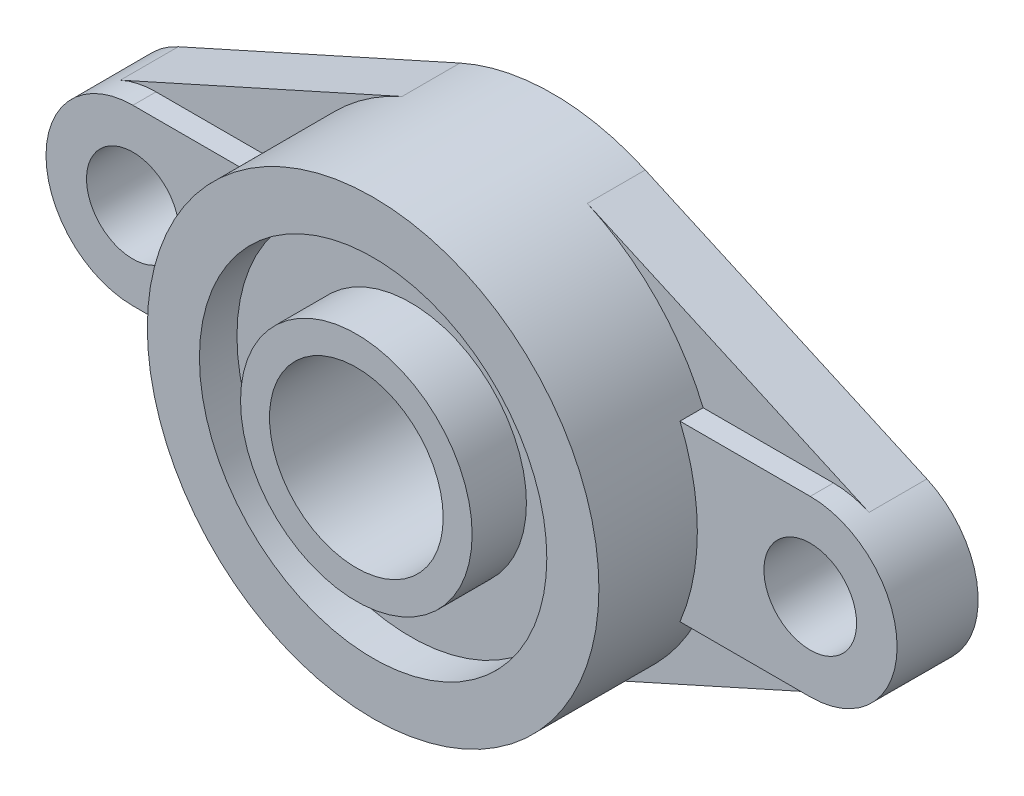
ISO-10303-21;
HEADER;
FILE_DESCRIPTION(('STEP AP214'),'2;1');
FILE_NAME('part.step','',(''),(''),'','','');
FILE_SCHEMA(('AUTOMOTIVE_DESIGN { 1 0 10303 214 1 1 1 1 }'));
ENDSEC;
DATA;
#1=APPLICATION_CONTEXT('core data for automotive mechanical design processes');
#2=APPLICATION_PROTOCOL_DEFINITION('international standard','automotive_design',2000,#1);
#3=PRODUCT_CONTEXT('',#1,'mechanical');
#4=PRODUCT('Part','Part','',(#3));
#5=PRODUCT_RELATED_PRODUCT_CATEGORY('part','',(#4));
#6=PRODUCT_DEFINITION_FORMATION('','',#4);
#7=PRODUCT_DEFINITION_CONTEXT('part definition',#1,'design');
#8=PRODUCT_DEFINITION('design','',#6,#7);
#9=PRODUCT_DEFINITION_SHAPE('','',#8);
#10=(LENGTH_UNIT() NAMED_UNIT(*) SI_UNIT(.MILLI.,.METRE.));
#11=(NAMED_UNIT(*) PLANE_ANGLE_UNIT() SI_UNIT($,.RADIAN.));
#12=(NAMED_UNIT(*) SI_UNIT($,.STERADIAN.) SOLID_ANGLE_UNIT());
#13=UNCERTAINTY_MEASURE_WITH_UNIT(LENGTH_MEASURE(1.E-05),#10,'distance_accuracy_value','');
#14=(GEOMETRIC_REPRESENTATION_CONTEXT(3) GLOBAL_UNCERTAINTY_ASSIGNED_CONTEXT((#13)) GLOBAL_UNIT_ASSIGNED_CONTEXT((#10,
#11,#12)) REPRESENTATION_CONTEXT('',''));
#15=CARTESIAN_POINT('',(0.,0.,0.));
#16=DIRECTION('',(0.,0.,1.));
#17=DIRECTION('',(1.,0.,0.));
#18=AXIS2_PLACEMENT_3D('',#15,#16,#17);
#19=CARTESIAN_POINT('',(0.,15.,33.9));
#20=DIRECTION('',(0.,0.,1.));
#21=DIRECTION('',(1.,0.,0.));
#22=AXIS2_PLACEMENT_3D('',#19,#20,#21);
#23=PLANE('',#22);
#24=CARTESIAN_POINT('',(0.,0.,33.9));
#25=DIRECTION('',(0.,0.,-1.));
#26=DIRECTION('',(-1.,0.,0.));
#27=AXIS2_PLACEMENT_3D('',#24,#25,#26);
#28=CIRCLE('',#27,20.);
#29=CARTESIAN_POINT('',(-20.,0.,33.9));
#30=VERTEX_POINT('',#29);
#31=EDGE_CURVE('E178',#30,#30,#28,.T.);
#32=ORIENTED_EDGE('',*,*,#31,.F.);
#33=EDGE_LOOP('',(#32));
#34=FACE_BOUND('',#33,.T.);
#35=CARTESIAN_POINT('',(0.,0.,33.9));
#36=DIRECTION('',(0.,0.,-1.));
#37=DIRECTION('',(1.,0.,0.));
#38=AXIS2_PLACEMENT_3D('',#35,#36,#37);
#39=CIRCLE('',#38,15.);
#40=CARTESIAN_POINT('',(15.,0.,33.9));
#41=VERTEX_POINT('',#40);
#42=EDGE_CURVE('E382',#41,#41,#39,.T.);
#43=ORIENTED_EDGE('',*,*,#42,.T.);
#44=EDGE_LOOP('',(#43));
#45=FACE_BOUND('',#44,.T.);
#46=ADVANCED_FACE('F16',(#34,#45),#23,.T.);
#47=CARTESIAN_POINT('',(0.,15.,-4.1));
#48=DIRECTION('',(0.,0.,1.));
#49=DIRECTION('',(1.,0.,0.));
#50=AXIS2_PLACEMENT_3D('',#47,#48,#49);
#51=PLANE('',#50);
#52=CARTESIAN_POINT('',(0.,0.,-4.1));
#53=DIRECTION('',(0.,0.,-1.));
#54=DIRECTION('',(-1.,0.,0.));
#55=AXIS2_PLACEMENT_3D('',#52,#53,#54);
#56=CIRCLE('',#55,20.);
#57=CARTESIAN_POINT('',(-20.,0.,-4.1));
#58=VERTEX_POINT('',#57);
#59=EDGE_CURVE('E162',#58,#58,#56,.T.);
#60=ORIENTED_EDGE('',*,*,#59,.T.);
#61=EDGE_LOOP('',(#60));
#62=FACE_BOUND('',#61,.T.);
#63=CARTESIAN_POINT('',(0.,0.,-4.1));
#64=DIRECTION('',(0.,0.,1.));
#65=DIRECTION('',(1.,0.,0.));
#66=AXIS2_PLACEMENT_3D('',#63,#64,#65);
#67=CIRCLE('',#66,15.);
#68=CARTESIAN_POINT('',(15.,0.,-4.09999999999999));
#69=VERTEX_POINT('',#68);
#70=EDGE_CURVE('E385',#69,#69,#67,.F.);
#71=ORIENTED_EDGE('',*,*,#70,.F.);
#72=EDGE_LOOP('',(#71));
#73=FACE_BOUND('',#72,.T.);
#74=ADVANCED_FACE('F395',(#62,#73),#51,.F.);
#75=CARTESIAN_POINT('',(-58.5,0.,9.99999999999997));
#76=DIRECTION('',(0.,0.,-1.));
#77=DIRECTION('',(-1.,0.,0.));
#78=AXIS2_PLACEMENT_3D('',#75,#76,#77);
#79=PLANE('',#78);
#80=CARTESIAN_POINT('',(0.,0.,10.));
#81=DIRECTION('',(0.,0.,-1.));
#82=DIRECTION('',(-1.,0.,0.));
#83=AXIS2_PLACEMENT_3D('',#80,#81,#82);
#84=CIRCLE('',#83,39.);
#85=CARTESIAN_POINT('',(-16.,-35.5668384875575,10.));
#86=VERTEX_POINT('',#85);
#87=CARTESIAN_POINT('',(-36.,-15.,9.99999999999998));
#88=VERTEX_POINT('',#87);
#89=EDGE_CURVE('E135',#86,#88,#84,.T.);
#90=ORIENTED_EDGE('',*,*,#89,.T.);
#91=DIRECTION('',(-1.,0.,0.));
#92=VECTOR('',#91,1.);
#93=CARTESIAN_POINT('',(-58.5,-15.0000000000001,9.99999999999997));
#94=LINE('',#93,#92);
#95=CARTESIAN_POINT('',(-58.5,-15.0000000000001,9.99999999999997));
#96=VERTEX_POINT('',#95);
#97=EDGE_CURVE('E192',#88,#96,#94,.T.);
#98=ORIENTED_EDGE('',*,*,#97,.T.);
#99=CARTESIAN_POINT('',(-58.5,0.,9.99999999999997));
#100=DIRECTION('',(0.,0.,-1.));
#101=DIRECTION('',(1.,0.,0.));
#102=AXIS2_PLACEMENT_3D('',#99,#100,#101);
#103=CIRCLE('',#102,15.);
#104=CARTESIAN_POINT('',(-64.6538461538462,-13.6795532644452,9.99999999999998));
#105=VERTEX_POINT('',#104);
#106=EDGE_CURVE('E138',#96,#105,#103,.T.);
#107=ORIENTED_EDGE('',*,*,#106,.T.);
#108=DIRECTION('',(-0.911970217629679,0.41025641025641,0.));
#109=VECTOR('',#108,1.);
#110=CARTESIAN_POINT('',(-64.6538461538462,-13.6795532644453,9.99999999999998));
#111=LINE('',#110,#109);
#112=EDGE_CURVE('E131',#86,#105,#111,.T.);
#113=ORIENTED_EDGE('',*,*,#112,.F.);
#114=EDGE_LOOP('',(#90,#98,#107,#113));
#115=FACE_BOUND('',#114,.T.);
#116=ADVANCED_FACE('F133',(#115),#79,.F.);
#117=CARTESIAN_POINT('',(36.,-15.,10.));
#118=VERTEX_POINT('',#117);
#119=CARTESIAN_POINT('',(16.,-35.5668384875575,10.));
#120=VERTEX_POINT('',#119);
#121=EDGE_CURVE('E159',#118,#120,#84,.T.);
#122=ORIENTED_EDGE('',*,*,#121,.T.);
#123=DIRECTION('',(-0.911970217629678,-0.410256410256412,0.));
#124=VECTOR('',#123,1.);
#125=CARTESIAN_POINT('',(64.6538461538462,-13.6795532644452,10.));
#126=LINE('',#125,#124);
#127=CARTESIAN_POINT('',(64.6538461538462,-13.6795532644452,10.));
#128=VERTEX_POINT('',#127);
#129=EDGE_CURVE('E142',#128,#120,#126,.T.);
#130=ORIENTED_EDGE('',*,*,#129,.F.);
#131=CARTESIAN_POINT('',(58.5,0.,10.));
#132=DIRECTION('',(0.,0.,-1.));
#133=DIRECTION('',(-1.,0.,0.));
#134=AXIS2_PLACEMENT_3D('',#131,#132,#133);
#135=CIRCLE('',#134,15.);
#136=CARTESIAN_POINT('',(58.5,-15.,10.));
#137=VERTEX_POINT('',#136);
#138=EDGE_CURVE('E241',#128,#137,#135,.T.);
#139=ORIENTED_EDGE('',*,*,#138,.T.);
#140=EDGE_CURVE('E188',#137,#118,#94,.T.);
#141=ORIENTED_EDGE('',*,*,#140,.T.);
#142=EDGE_LOOP('',(#122,#130,#139,#141));
#143=FACE_BOUND('',#142,.T.);
#144=ADVANCED_FACE('F357',(#143),#79,.F.);
#145=CARTESIAN_POINT('',(16.,35.5668384875575,10.));
#146=VERTEX_POINT('',#145);
#147=CARTESIAN_POINT('',(36.,15.,10.));
#148=VERTEX_POINT('',#147);
#149=EDGE_CURVE('E32',#146,#148,#84,.T.);
#150=ORIENTED_EDGE('',*,*,#149,.T.);
#151=DIRECTION('',(1.,0.,0.));
#152=VECTOR('',#151,1.);
#153=CARTESIAN_POINT('',(-58.5,15.,9.99999999999997));
#154=LINE('',#153,#152);
#155=CARTESIAN_POINT('',(58.5,15.,10.));
#156=VERTEX_POINT('',#155);
#157=EDGE_CURVE('E187',#148,#156,#154,.T.);
#158=ORIENTED_EDGE('',*,*,#157,.T.);
#159=CARTESIAN_POINT('',(64.6538461538463,13.6795532644452,10.));
#160=VERTEX_POINT('',#159);
#161=EDGE_CURVE('E196',#156,#160,#135,.T.);
#162=ORIENTED_EDGE('',*,*,#161,.T.);
#163=DIRECTION('',(0.911970217629679,-0.41025641025641,0.));
#164=VECTOR('',#163,1.);
#165=CARTESIAN_POINT('',(16.,35.5668384875575,10.));
#166=LINE('',#165,#164);
#167=EDGE_CURVE('E255',#146,#160,#166,.T.);
#168=ORIENTED_EDGE('',*,*,#167,.F.);
#169=EDGE_LOOP('',(#150,#158,#162,#168));
#170=FACE_BOUND('',#169,.T.);
#171=ADVANCED_FACE('F417',(#170),#79,.F.);
#172=CARTESIAN_POINT('',(-36.,15.,9.99999999999998));
#173=VERTEX_POINT('',#172);
#174=CARTESIAN_POINT('',(-16.,35.5668384875575,9.99999999999998));
#175=VERTEX_POINT('',#174);
#176=EDGE_CURVE('E160',#173,#175,#84,.T.);
#177=ORIENTED_EDGE('',*,*,#176,.T.);
#178=DIRECTION('',(0.911970217629679,0.410256410256411,0.));
#179=VECTOR('',#178,1.);
#180=CARTESIAN_POINT('',(-64.6538461538461,13.6795532644452,9.99999999999997));
#181=LINE('',#180,#179);
#182=CARTESIAN_POINT('',(-64.6538461538461,13.6795532644452,9.99999999999997));
#183=VERTEX_POINT('',#182);
#184=EDGE_CURVE('E264',#183,#175,#181,.T.);
#185=ORIENTED_EDGE('',*,*,#184,.F.);
#186=CARTESIAN_POINT('',(-58.5,15.,9.99999999999997));
#187=VERTEX_POINT('',#186);
#188=EDGE_CURVE('E246',#183,#187,#103,.T.);
#189=ORIENTED_EDGE('',*,*,#188,.T.);
#190=EDGE_CURVE('E193',#187,#173,#154,.T.);
#191=ORIENTED_EDGE('',*,*,#190,.T.);
#192=EDGE_LOOP('',(#177,#185,#189,#191));
#193=FACE_BOUND('',#192,.T.);
#194=ADVANCED_FACE('F318',(#193),#79,.F.);
#195=CARTESIAN_POINT('',(-58.5,0.,0.));
#196=DIRECTION('',(0.,0.,-1.));
#197=DIRECTION('',(-1.,0.,0.));
#198=AXIS2_PLACEMENT_3D('',#195,#196,#197);
#199=PLANE('',#198);
#200=CARTESIAN_POINT('',(58.5,0.,0.));
#201=DIRECTION('',(0.,0.,1.));
#202=DIRECTION('',(1.,0.,0.));
#203=AXIS2_PLACEMENT_3D('',#200,#201,#202);
#204=CIRCLE('',#203,8.);
#205=CARTESIAN_POINT('',(66.5,0.,0.));
#206=VERTEX_POINT('',#205);
#207=EDGE_CURVE('E268',#206,#206,#204,.T.);
#208=ORIENTED_EDGE('',*,*,#207,.T.);
#209=EDGE_LOOP('',(#208));
#210=FACE_BOUND('',#209,.T.);
#211=CARTESIAN_POINT('',(-58.5,0.,0.));
#212=DIRECTION('',(0.,0.,-1.));
#213=DIRECTION('',(1.,0.,0.));
#214=AXIS2_PLACEMENT_3D('',#211,#212,#213);
#215=CIRCLE('',#214,15.);
#216=CARTESIAN_POINT('',(-64.6538461538462,-13.6795532644452,0.));
#217=VERTEX_POINT('',#216);
#218=CARTESIAN_POINT('',(-64.6538461538461,13.6795532644452,0.));
#219=VERTEX_POINT('',#218);
#220=EDGE_CURVE('E227',#217,#219,#215,.T.);
#221=ORIENTED_EDGE('',*,*,#220,.T.);
#222=DIRECTION('',(0.911970217629679,0.410256410256411,0.));
#223=VECTOR('',#222,1.);
#224=CARTESIAN_POINT('',(-64.6538461538461,13.6795532644452,0.));
#225=LINE('',#224,#223);
#226=CARTESIAN_POINT('',(-16.,35.5668384875575,0.));
#227=VERTEX_POINT('',#226);
#228=EDGE_CURVE('E299',#219,#227,#225,.T.);
#229=ORIENTED_EDGE('',*,*,#228,.T.);
#230=CARTESIAN_POINT('',(0.,0.,0.));
#231=DIRECTION('',(0.,0.,-1.));
#232=DIRECTION('',(1.,0.,0.));
#233=AXIS2_PLACEMENT_3D('',#230,#231,#232);
#234=CIRCLE('',#233,39.);
#235=CARTESIAN_POINT('',(16.,35.5668384875574,0.));
#236=VERTEX_POINT('',#235);
#237=EDGE_CURVE('E304',#227,#236,#234,.T.);
#238=ORIENTED_EDGE('',*,*,#237,.T.);
#239=DIRECTION('',(0.911970217629679,-0.41025641025641,0.));
#240=VECTOR('',#239,1.);
#241=CARTESIAN_POINT('',(16.,35.5668384875574,0.));
#242=LINE('',#241,#240);
#243=CARTESIAN_POINT('',(64.6538461538463,13.6795532644452,0.));
#244=VERTEX_POINT('',#243);
#245=EDGE_CURVE('E324',#236,#244,#242,.T.);
#246=ORIENTED_EDGE('',*,*,#245,.T.);
#247=CARTESIAN_POINT('',(58.5,0.,0.));
#248=DIRECTION('',(0.,0.,-1.));
#249=DIRECTION('',(-1.,0.,0.));
#250=AXIS2_PLACEMENT_3D('',#247,#248,#249);
#251=CIRCLE('',#250,15.);
#252=CARTESIAN_POINT('',(64.6538461538462,-13.6795532644452,0.));
#253=VERTEX_POINT('',#252);
#254=EDGE_CURVE('E329',#244,#253,#251,.T.);
#255=ORIENTED_EDGE('',*,*,#254,.T.);
#256=DIRECTION('',(-0.911970217629678,-0.410256410256412,0.));
#257=VECTOR('',#256,1.);
#258=CARTESIAN_POINT('',(64.6538461538462,-13.6795532644452,0.));
#259=LINE('',#258,#257);
#260=CARTESIAN_POINT('',(16.,-35.5668384875575,0.));
#261=VERTEX_POINT('',#260);
#262=EDGE_CURVE('E334',#253,#261,#259,.T.);
#263=ORIENTED_EDGE('',*,*,#262,.T.);
#264=CARTESIAN_POINT('',(0.,0.,0.));
#265=DIRECTION('',(0.,0.,-1.));
#266=DIRECTION('',(1.,0.,0.));
#267=AXIS2_PLACEMENT_3D('',#264,#265,#266);
#268=CIRCLE('',#267,39.);
#269=CARTESIAN_POINT('',(-16.,-35.5668384875575,0.));
#270=VERTEX_POINT('',#269);
#271=EDGE_CURVE('E293',#261,#270,#268,.T.);
#272=ORIENTED_EDGE('',*,*,#271,.T.);
#273=DIRECTION('',(-0.911970217629679,0.41025641025641,0.));
#274=VECTOR('',#273,1.);
#275=CARTESIAN_POINT('',(-64.6538461538462,-13.6795532644452,0.));
#276=LINE('',#275,#274);
#277=EDGE_CURVE('E148',#270,#217,#276,.T.);
#278=ORIENTED_EDGE('',*,*,#277,.T.);
#279=EDGE_LOOP('',(#221,#229,#238,#246,#255,#263,#272,#278));
#280=FACE_BOUND('',#279,.T.);
#281=CARTESIAN_POINT('',(-58.5,0.,0.));
#282=DIRECTION('',(0.,0.,1.));
#283=DIRECTION('',(1.,0.,0.));
#284=AXIS2_PLACEMENT_3D('',#281,#282,#283);
#285=CIRCLE('',#284,8.);
#286=CARTESIAN_POINT('',(-50.5,0.,0.));
#287=VERTEX_POINT('',#286);
#288=EDGE_CURVE('E275',#287,#287,#285,.T.);
#289=ORIENTED_EDGE('',*,*,#288,.T.);
#290=EDGE_LOOP('',(#289));
#291=FACE_BOUND('',#290,.T.);
#292=CARTESIAN_POINT('',(0.,0.,0.));
#293=DIRECTION('',(0.,0.,-1.));
#294=DIRECTION('',(-1.,0.,0.));
#295=AXIS2_PLACEMENT_3D('',#292,#293,#294);
#296=CIRCLE('',#295,20.);
#297=CARTESIAN_POINT('',(-20.,0.,0.));
#298=VERTEX_POINT('',#297);
#299=EDGE_CURVE('E11',#298,#298,#296,.F.);
#300=ORIENTED_EDGE('',*,*,#299,.T.);
#301=EDGE_LOOP('',(#300));
#302=FACE_BOUND('',#301,.T.);
#303=ADVANCED_FACE('F289',(#210,#280,#291,#302),#199,.T.);
#304=CARTESIAN_POINT('',(-58.5,14.9999999999999,14.));
#305=DIRECTION('',(0.,1.,0.));
#306=DIRECTION('',(0.,0.,1.));
#307=AXIS2_PLACEMENT_3D('',#304,#305,#306);
#308=PLANE('',#307);
#309=ORIENTED_EDGE('',*,*,#157,.F.);
#310=DIRECTION('',(0.,0.,-1.));
#311=VECTOR('',#310,1.);
#312=CARTESIAN_POINT('',(36.,15.,44.2691872507125));
#313=LINE('',#312,#311);
#314=CARTESIAN_POINT('',(36.,15.,14.));
#315=VERTEX_POINT('',#314);
#316=EDGE_CURVE('E185',#148,#315,#313,.F.);
#317=ORIENTED_EDGE('',*,*,#316,.T.);
#318=DIRECTION('',(1.,0.,0.));
#319=VECTOR('',#318,1.);
#320=CARTESIAN_POINT('',(-58.5,14.9999999999999,14.));
#321=LINE('',#320,#319);
#322=CARTESIAN_POINT('',(58.5,15.,14.));
#323=VERTEX_POINT('',#322);
#324=EDGE_CURVE('E210',#315,#323,#321,.T.);
#325=ORIENTED_EDGE('',*,*,#324,.T.);
#326=DIRECTION('',(0.,0.,-1.));
#327=VECTOR('',#326,1.);
#328=CARTESIAN_POINT('',(58.5,15.,14.));
#329=LINE('',#328,#327);
#330=EDGE_CURVE('E224',#323,#156,#329,.T.);
#331=ORIENTED_EDGE('',*,*,#330,.T.);
#332=EDGE_LOOP('',(#309,#317,#325,#331));
#333=FACE_BOUND('',#332,.T.);
#334=ADVANCED_FACE('F407',(#333),#308,.T.);
#335=CARTESIAN_POINT('',(-58.5,14.9999999999999,14.));
#336=VERTEX_POINT('',#335);
#337=CARTESIAN_POINT('',(-36.,15.,14.));
#338=VERTEX_POINT('',#337);
#339=EDGE_CURVE('E201',#336,#338,#321,.T.);
#340=ORIENTED_EDGE('',*,*,#339,.T.);
#341=DIRECTION('',(0.,0.,-1.));
#342=VECTOR('',#341,1.);
#343=CARTESIAN_POINT('',(-36.,15.,44.2691872507125));
#344=LINE('',#343,#342);
#345=EDGE_CURVE('E40',#338,#173,#344,.T.);
#346=ORIENTED_EDGE('',*,*,#345,.T.);
#347=ORIENTED_EDGE('',*,*,#190,.F.);
#348=DIRECTION('',(0.,0.,-1.));
#349=VECTOR('',#348,1.);
#350=CARTESIAN_POINT('',(-58.5,14.9999999999999,14.));
#351=LINE('',#350,#349);
#352=EDGE_CURVE('E216',#336,#187,#351,.T.);
#353=ORIENTED_EDGE('',*,*,#352,.F.);
#354=EDGE_LOOP('',(#340,#346,#347,#353));
#355=FACE_BOUND('',#354,.T.);
#356=ADVANCED_FACE('F372',(#355),#308,.T.);
#357=CARTESIAN_POINT('',(-58.5,-15.,14.));
#358=DIRECTION('',(0.,-1.,0.));
#359=DIRECTION('',(0.,0.,-1.));
#360=AXIS2_PLACEMENT_3D('',#357,#358,#359);
#361=PLANE('',#360);
#362=ORIENTED_EDGE('',*,*,#97,.F.);
#363=DIRECTION('',(0.,0.,-1.));
#364=VECTOR('',#363,1.);
#365=CARTESIAN_POINT('',(-36.,-15.,44.2691872507125));
#366=LINE('',#365,#364);
#367=CARTESIAN_POINT('',(-36.,-15.,14.));
#368=VERTEX_POINT('',#367);
#369=EDGE_CURVE('E158',#88,#368,#366,.F.);
#370=ORIENTED_EDGE('',*,*,#369,.T.);
#371=DIRECTION('',(-1.,0.,0.));
#372=VECTOR('',#371,1.);
#373=CARTESIAN_POINT('',(-58.5,-15.,14.));
#374=LINE('',#373,#372);
#375=CARTESIAN_POINT('',(-58.5,-15.,14.));
#376=VERTEX_POINT('',#375);
#377=EDGE_CURVE('E200',#368,#376,#374,.T.);
#378=ORIENTED_EDGE('',*,*,#377,.T.);
#379=DIRECTION('',(0.,0.,-1.));
#380=VECTOR('',#379,1.);
#381=CARTESIAN_POINT('',(-58.5,-15.,14.));
#382=LINE('',#381,#380);
#383=EDGE_CURVE('E219',#376,#96,#382,.T.);
#384=ORIENTED_EDGE('',*,*,#383,.T.);
#385=EDGE_LOOP('',(#362,#370,#378,#384));
#386=FACE_BOUND('',#385,.T.);
#387=ADVANCED_FACE('F375',(#386),#361,.T.);
#388=CARTESIAN_POINT('',(58.5,-15.,14.));
#389=VERTEX_POINT('',#388);
#390=CARTESIAN_POINT('',(36.,-15.,14.));
#391=VERTEX_POINT('',#390);
#392=EDGE_CURVE('E202',#389,#391,#374,.T.);
#393=ORIENTED_EDGE('',*,*,#392,.T.);
#394=DIRECTION('',(0.,0.,-1.));
#395=VECTOR('',#394,1.);
#396=CARTESIAN_POINT('',(36.,-15.,44.2691872507125));
#397=LINE('',#396,#395);
#398=EDGE_CURVE('E183',#391,#118,#397,.T.);
#399=ORIENTED_EDGE('',*,*,#398,.T.);
#400=ORIENTED_EDGE('',*,*,#140,.F.);
#401=DIRECTION('',(0.,0.,-1.));
#402=VECTOR('',#401,1.);
#403=CARTESIAN_POINT('',(58.5,-15.,14.));
#404=LINE('',#403,#402);
#405=EDGE_CURVE('E222',#389,#137,#404,.T.);
#406=ORIENTED_EDGE('',*,*,#405,.F.);
#407=EDGE_LOOP('',(#393,#399,#400,#406));
#408=FACE_BOUND('',#407,.T.);
#409=ADVANCED_FACE('F360',(#408),#361,.T.);
#410=CARTESIAN_POINT('',(58.5,0.,14.));
#411=DIRECTION('',(0.,0.,-1.));
#412=DIRECTION('',(-1.,0.,0.));
#413=AXIS2_PLACEMENT_3D('',#410,#411,#412);
#414=PLANE('',#413);
#415=CARTESIAN_POINT('',(58.5,0.,14.));
#416=DIRECTION('',(0.,0.,1.));
#417=DIRECTION('',(1.,0.,0.));
#418=AXIS2_PLACEMENT_3D('',#415,#416,#417);
#419=CIRCLE('',#418,8.);
#420=CARTESIAN_POINT('',(66.5,0.,14.));
#421=VERTEX_POINT('',#420);
#422=EDGE_CURVE('E213',#421,#421,#419,.T.);
#423=ORIENTED_EDGE('',*,*,#422,.F.);
#424=EDGE_LOOP('',(#423));
#425=FACE_BOUND('',#424,.T.);
#426=CARTESIAN_POINT('',(0.,0.,14.));
#427=DIRECTION('',(0.,0.,-1.));
#428=DIRECTION('',(-1.,0.,0.));
#429=AXIS2_PLACEMENT_3D('',#426,#427,#428);
#430=CIRCLE('',#429,39.);
#431=EDGE_CURVE('E25',#391,#315,#430,.F.);
#432=ORIENTED_EDGE('',*,*,#431,.F.);
#433=ORIENTED_EDGE('',*,*,#392,.F.);
#434=CARTESIAN_POINT('',(58.5,0.,14.));
#435=DIRECTION('',(0.,0.,-1.));
#436=DIRECTION('',(-1.,0.,0.));
#437=AXIS2_PLACEMENT_3D('',#434,#435,#436);
#438=CIRCLE('',#437,15.);
#439=EDGE_CURVE('E197',#323,#389,#438,.T.);
#440=ORIENTED_EDGE('',*,*,#439,.F.);
#441=ORIENTED_EDGE('',*,*,#324,.F.);
#442=EDGE_LOOP('',(#432,#433,#440,#441));
#443=FACE_BOUND('',#442,.T.);
#444=ADVANCED_FACE('F364',(#425,#443),#414,.F.);
#445=CARTESIAN_POINT('',(-58.5,0.,14.));
#446=DIRECTION('',(0.,0.,1.));
#447=DIRECTION('',(1.,0.,0.));
#448=AXIS2_PLACEMENT_3D('',#445,#446,#447);
#449=CIRCLE('',#448,8.);
#450=CARTESIAN_POINT('',(-50.5,0.,14.));
#451=VERTEX_POINT('',#450);
#452=EDGE_CURVE('E208',#451,#451,#449,.T.);
#453=ORIENTED_EDGE('',*,*,#452,.F.);
#454=EDGE_LOOP('',(#453));
#455=FACE_BOUND('',#454,.T.);
#456=EDGE_CURVE('E20',#338,#368,#430,.F.);
#457=ORIENTED_EDGE('',*,*,#456,.F.);
#458=ORIENTED_EDGE('',*,*,#339,.F.);
#459=CARTESIAN_POINT('',(-58.5,0.,14.));
#460=DIRECTION('',(0.,0.,-1.));
#461=DIRECTION('',(1.,0.,0.));
#462=AXIS2_PLACEMENT_3D('',#459,#460,#461);
#463=CIRCLE('',#462,15.);
#464=EDGE_CURVE('E205',#376,#336,#463,.T.);
#465=ORIENTED_EDGE('',*,*,#464,.F.);
#466=ORIENTED_EDGE('',*,*,#377,.F.);
#467=EDGE_LOOP('',(#457,#458,#465,#466));
#468=FACE_BOUND('',#467,.T.);
#469=ADVANCED_FACE('F370',(#455,#468),#414,.F.);
#470=CARTESIAN_POINT('',(-58.5,0.,9.99999999999997));
#471=DIRECTION('',(0.,0.,-1.));
#472=DIRECTION('',(-1.,0.,0.));
#473=AXIS2_PLACEMENT_3D('',#470,#471,#472);
#474=CYLINDRICAL_SURFACE('',#473,15.);
#475=ORIENTED_EDGE('',*,*,#220,.F.);
#476=DIRECTION('',(0.,0.,-1.));
#477=VECTOR('',#476,1.);
#478=CARTESIAN_POINT('',(-64.6538461538462,-13.6795532644453,9.99999999999998));
#479=LINE('',#478,#477);
#480=EDGE_CURVE('E141',#105,#217,#479,.T.);
#481=ORIENTED_EDGE('',*,*,#480,.F.);
#482=ORIENTED_EDGE('',*,*,#106,.F.);
#483=ORIENTED_EDGE('',*,*,#383,.F.);
#484=ORIENTED_EDGE('',*,*,#464,.T.);
#485=ORIENTED_EDGE('',*,*,#352,.T.);
#486=ORIENTED_EDGE('',*,*,#188,.F.);
#487=DIRECTION('',(0.,0.,-1.));
#488=VECTOR('',#487,1.);
#489=CARTESIAN_POINT('',(-64.6538461538461,13.6795532644452,9.99999999999997));
#490=LINE('',#489,#488);
#491=EDGE_CURVE('E296',#183,#219,#490,.T.);
#492=ORIENTED_EDGE('',*,*,#491,.T.);
#493=EDGE_LOOP('',(#475,#481,#482,#483,#484,#485,#486,#492));
#494=FACE_BOUND('',#493,.T.);
#495=ADVANCED_FACE('F18',(#494),#474,.T.);
#496=CARTESIAN_POINT('',(-64.6538461538461,13.6795532644452,9.99999999999997));
#497=DIRECTION('',(-0.41025641025641,0.911970217629679,0.));
#498=DIRECTION('',(-0.911970217629679,-0.410256410256411,0.));
#499=AXIS2_PLACEMENT_3D('',#496,#497,#498);
#500=PLANE('',#499);
#501=ORIENTED_EDGE('',*,*,#228,.F.);
#502=ORIENTED_EDGE('',*,*,#491,.F.);
#503=ORIENTED_EDGE('',*,*,#184,.T.);
#504=DIRECTION('',(0.,0.,-1.));
#505=VECTOR('',#504,1.);
#506=CARTESIAN_POINT('',(-16.,35.5668384875575,9.99999999999998));
#507=LINE('',#506,#505);
#508=EDGE_CURVE('E235',#175,#227,#507,.T.);
#509=ORIENTED_EDGE('',*,*,#508,.T.);
#510=EDGE_LOOP('',(#501,#502,#503,#509));
#511=FACE_BOUND('',#510,.T.);
#512=ADVANCED_FACE('F320',(#511),#500,.T.);
#513=CARTESIAN_POINT('',(16.,35.5668384875575,10.));
#514=DIRECTION('',(0.41025641025641,0.911970217629679,0.));
#515=DIRECTION('',(-0.911970217629679,0.41025641025641,0.));
#516=AXIS2_PLACEMENT_3D('',#513,#514,#515);
#517=PLANE('',#516);
#518=ORIENTED_EDGE('',*,*,#245,.F.);
#519=DIRECTION('',(0.,0.,-1.));
#520=VECTOR('',#519,1.);
#521=CARTESIAN_POINT('',(16.,35.5668384875575,10.));
#522=LINE('',#521,#520);
#523=EDGE_CURVE('E259',#146,#236,#522,.T.);
#524=ORIENTED_EDGE('',*,*,#523,.F.);
#525=ORIENTED_EDGE('',*,*,#167,.T.);
#526=DIRECTION('',(0.,0.,-1.));
#527=VECTOR('',#526,1.);
#528=CARTESIAN_POINT('',(64.6538461538463,13.6795532644452,10.));
#529=LINE('',#528,#527);
#530=EDGE_CURVE('E250',#160,#244,#529,.T.);
#531=ORIENTED_EDGE('',*,*,#530,.T.);
#532=EDGE_LOOP('',(#518,#524,#525,#531));
#533=FACE_BOUND('',#532,.T.);
#534=ADVANCED_FACE('F664',(#533),#517,.T.);
#535=CARTESIAN_POINT('',(58.5,0.,10.));
#536=DIRECTION('',(0.,0.,-1.));
#537=DIRECTION('',(-1.,0.,0.));
#538=AXIS2_PLACEMENT_3D('',#535,#536,#537);
#539=CYLINDRICAL_SURFACE('',#538,15.);
#540=ORIENTED_EDGE('',*,*,#254,.F.);
#541=ORIENTED_EDGE('',*,*,#530,.F.);
#542=ORIENTED_EDGE('',*,*,#161,.F.);
#543=ORIENTED_EDGE('',*,*,#330,.F.);
#544=ORIENTED_EDGE('',*,*,#439,.T.);
#545=ORIENTED_EDGE('',*,*,#405,.T.);
#546=ORIENTED_EDGE('',*,*,#138,.F.);
#547=DIRECTION('',(0.,0.,-1.));
#548=VECTOR('',#547,1.);
#549=CARTESIAN_POINT('',(64.6538461538462,-13.6795532644452,10.));
#550=LINE('',#549,#548);
#551=EDGE_CURVE('E248',#128,#253,#550,.T.);
#552=ORIENTED_EDGE('',*,*,#551,.T.);
#553=EDGE_LOOP('',(#540,#541,#542,#543,#544,#545,#546,#552));
#554=FACE_BOUND('',#553,.T.);
#555=ADVANCED_FACE('F653',(#554),#539,.T.);
#556=CARTESIAN_POINT('',(64.6538461538462,-13.6795532644452,10.));
#557=DIRECTION('',(0.410256410256411,-0.911970217629678,0.));
#558=DIRECTION('',(0.911970217629678,0.410256410256412,0.));
#559=AXIS2_PLACEMENT_3D('',#556,#557,#558);
#560=PLANE('',#559);
#561=ORIENTED_EDGE('',*,*,#262,.F.);
#562=ORIENTED_EDGE('',*,*,#551,.F.);
#563=ORIENTED_EDGE('',*,*,#129,.T.);
#564=DIRECTION('',(0.,0.,-1.));
#565=VECTOR('',#564,1.);
#566=CARTESIAN_POINT('',(16.,-35.5668384875575,10.));
#567=LINE('',#566,#565);
#568=EDGE_CURVE('E152',#120,#261,#567,.T.);
#569=ORIENTED_EDGE('',*,*,#568,.T.);
#570=EDGE_LOOP('',(#561,#562,#563,#569));
#571=FACE_BOUND('',#570,.T.);
#572=ADVANCED_FACE('F350',(#571),#560,.T.);
#573=CARTESIAN_POINT('',(0.,0.,10.));
#574=DIRECTION('',(0.,0.,-1.));
#575=DIRECTION('',(-1.,0.,0.));
#576=AXIS2_PLACEMENT_3D('',#573,#574,#575);
#577=CYLINDRICAL_SURFACE('',#576,39.);
#578=ORIENTED_EDGE('',*,*,#149,.F.);
#579=ORIENTED_EDGE('',*,*,#523,.T.);
#580=ORIENTED_EDGE('',*,*,#237,.F.);
#581=ORIENTED_EDGE('',*,*,#508,.F.);
#582=ORIENTED_EDGE('',*,*,#176,.F.);
#583=ORIENTED_EDGE('',*,*,#345,.F.);
#584=ORIENTED_EDGE('',*,*,#456,.T.);
#585=ORIENTED_EDGE('',*,*,#369,.F.);
#586=ORIENTED_EDGE('',*,*,#89,.F.);
#587=DIRECTION('',(0.,0.,-1.));
#588=VECTOR('',#587,1.);
#589=CARTESIAN_POINT('',(-16.,-35.5668384875575,10.));
#590=LINE('',#589,#588);
#591=EDGE_CURVE('E145',#86,#270,#590,.T.);
#592=ORIENTED_EDGE('',*,*,#591,.T.);
#593=ORIENTED_EDGE('',*,*,#271,.F.);
#594=ORIENTED_EDGE('',*,*,#568,.F.);
#595=ORIENTED_EDGE('',*,*,#121,.F.);
#596=ORIENTED_EDGE('',*,*,#398,.F.);
#597=ORIENTED_EDGE('',*,*,#431,.T.);
#598=ORIENTED_EDGE('',*,*,#316,.F.);
#599=EDGE_LOOP('',(#578,#579,#580,#581,#582,#583,#584,#585,#586,#592,#593,#594,#595,#596,#597,#598));
#600=FACE_BOUND('',#599,.T.);
#601=CARTESIAN_POINT('',(0.,0.,31.));
#602=DIRECTION('',(0.,0.,-1.));
#603=DIRECTION('',(-1.,0.,0.));
#604=AXIS2_PLACEMENT_3D('',#601,#602,#603);
#605=CIRCLE('',#604,39.);
#606=CARTESIAN_POINT('',(-39.,0.,31.));
#607=VERTEX_POINT('',#606);
#608=EDGE_CURVE('E166',#607,#607,#605,.T.);
#609=ORIENTED_EDGE('',*,*,#608,.T.);
#610=EDGE_LOOP('',(#609));
#611=FACE_BOUND('',#610,.T.);
#612=ADVANCED_FACE('F155',(#600,#611),#577,.T.);
#613=CARTESIAN_POINT('',(-64.6538461538462,-13.6795532644453,9.99999999999998));
#614=DIRECTION('',(-0.410256410256411,-0.911970217629679,0.));
#615=DIRECTION('',(0.911970217629679,-0.41025641025641,0.));
#616=AXIS2_PLACEMENT_3D('',#613,#614,#615);
#617=PLANE('',#616);
#618=ORIENTED_EDGE('',*,*,#277,.F.);
#619=ORIENTED_EDGE('',*,*,#591,.F.);
#620=ORIENTED_EDGE('',*,*,#112,.T.);
#621=ORIENTED_EDGE('',*,*,#480,.T.);
#622=EDGE_LOOP('',(#618,#619,#620,#621));
#623=FACE_BOUND('',#622,.T.);
#624=ADVANCED_FACE('F146',(#623),#617,.T.);
#625=CARTESIAN_POINT('',(-58.5,0.,9.99999999999997));
#626=DIRECTION('',(0.,0.,-1.));
#627=DIRECTION('',(-1.,0.,0.));
#628=AXIS2_PLACEMENT_3D('',#625,#626,#627);
#629=CYLINDRICAL_SURFACE('',#628,8.);
#630=ORIENTED_EDGE('',*,*,#288,.F.);
#631=EDGE_LOOP('',(#630));
#632=FACE_BOUND('',#631,.T.);
#633=ORIENTED_EDGE('',*,*,#452,.T.);
#634=EDGE_LOOP('',(#633));
#635=FACE_BOUND('',#634,.T.);
#636=ADVANCED_FACE('F603',(#632,#635),#629,.F.);
#637=CARTESIAN_POINT('',(58.5,0.,10.));
#638=DIRECTION('',(0.,0.,-1.));
#639=DIRECTION('',(-1.,0.,0.));
#640=AXIS2_PLACEMENT_3D('',#637,#638,#639);
#641=CYLINDRICAL_SURFACE('',#640,8.);
#642=ORIENTED_EDGE('',*,*,#207,.F.);
#643=EDGE_LOOP('',(#642));
#644=FACE_BOUND('',#643,.T.);
#645=ORIENTED_EDGE('',*,*,#422,.T.);
#646=EDGE_LOOP('',(#645));
#647=FACE_BOUND('',#646,.T.);
#648=ADVANCED_FACE('F590',(#644,#647),#641,.F.);
#649=CARTESIAN_POINT('',(0.,39.,31.));
#650=DIRECTION('',(0.,0.,-1.));
#651=DIRECTION('',(-1.,0.,0.));
#652=AXIS2_PLACEMENT_3D('',#649,#650,#651);
#653=PLANE('',#652);
#654=ORIENTED_EDGE('',*,*,#608,.F.);
#655=EDGE_LOOP('',(#654));
#656=FACE_BOUND('',#655,.T.);
#657=CARTESIAN_POINT('',(0.,0.,31.));
#658=DIRECTION('',(0.,0.,-1.));
#659=DIRECTION('',(-1.,0.,0.));
#660=AXIS2_PLACEMENT_3D('',#657,#658,#659);
#661=CIRCLE('',#660,30.);
#662=CARTESIAN_POINT('',(-30.,0.,31.));
#663=VERTEX_POINT('',#662);
#664=EDGE_CURVE('E169',#663,#663,#661,.T.);
#665=ORIENTED_EDGE('',*,*,#664,.T.);
#666=EDGE_LOOP('',(#665));
#667=FACE_BOUND('',#666,.T.);
#668=ADVANCED_FACE('F578',(#656,#667),#653,.F.);
#669=CARTESIAN_POINT('',(0.,0.,44.2691872507125));
#670=DIRECTION('',(0.,0.,-1.));
#671=DIRECTION('',(-1.,0.,0.));
#672=AXIS2_PLACEMENT_3D('',#669,#670,#671);
#673=CYLINDRICAL_SURFACE('',#672,30.);
#674=ORIENTED_EDGE('',*,*,#664,.F.);
#675=EDGE_LOOP('',(#674));
#676=FACE_BOUND('',#675,.T.);
#677=CARTESIAN_POINT('',(0.,0.,24.5205578923214));
#678=DIRECTION('',(0.,0.,-1.));
#679=DIRECTION('',(-1.,0.,0.));
#680=AXIS2_PLACEMENT_3D('',#677,#678,#679);
#681=CIRCLE('',#680,30.);
#682=CARTESIAN_POINT('',(-30.,0.,24.5205578923214));
#683=VERTEX_POINT('',#682);
#684=EDGE_CURVE('E172',#683,#683,#681,.T.);
#685=ORIENTED_EDGE('',*,*,#684,.T.);
#686=EDGE_LOOP('',(#685));
#687=FACE_BOUND('',#686,.T.);
#688=ADVANCED_FACE('F567',(#676,#687),#673,.F.);
#689=CARTESIAN_POINT('',(0.,30.,24.5205578923214));
#690=DIRECTION('',(0.,0.,-1.));
#691=DIRECTION('',(-1.,0.,0.));
#692=AXIS2_PLACEMENT_3D('',#689,#690,#691);
#693=PLANE('',#692);
#694=ORIENTED_EDGE('',*,*,#684,.F.);
#695=EDGE_LOOP('',(#694));
#696=FACE_BOUND('',#695,.T.);
#697=CARTESIAN_POINT('',(0.,0.,24.5205578923214));
#698=DIRECTION('',(0.,0.,-1.));
#699=DIRECTION('',(-1.,0.,0.));
#700=AXIS2_PLACEMENT_3D('',#697,#698,#699);
#701=CIRCLE('',#700,20.);
#702=CARTESIAN_POINT('',(-20.,0.,24.5205578923214));
#703=VERTEX_POINT('',#702);
#704=EDGE_CURVE('E175',#703,#703,#701,.T.);
#705=ORIENTED_EDGE('',*,*,#704,.T.);
#706=EDGE_LOOP('',(#705));
#707=FACE_BOUND('',#706,.T.);
#708=ADVANCED_FACE('F557',(#696,#707),#693,.F.);
#709=CARTESIAN_POINT('',(0.,0.,44.2691872507125));
#710=DIRECTION('',(0.,0.,-1.));
#711=DIRECTION('',(-1.,0.,0.));
#712=AXIS2_PLACEMENT_3D('',#709,#710,#711);
#713=CYLINDRICAL_SURFACE('',#712,20.);
#714=ORIENTED_EDGE('',*,*,#704,.F.);
#715=EDGE_LOOP('',(#714));
#716=FACE_BOUND('',#715,.T.);
#717=ORIENTED_EDGE('',*,*,#31,.T.);
#718=EDGE_LOOP('',(#717));
#719=FACE_BOUND('',#718,.T.);
#720=ADVANCED_FACE('F402',(#716,#719),#713,.T.);
#721=CARTESIAN_POINT('',(0.,0.,44.2691872507125));
#722=DIRECTION('',(0.,0.,-1.));
#723=DIRECTION('',(-1.,0.,0.));
#724=AXIS2_PLACEMENT_3D('',#721,#722,#723);
#725=CYLINDRICAL_SURFACE('',#724,20.);
#726=ORIENTED_EDGE('',*,*,#59,.F.);
#727=EDGE_LOOP('',(#726));
#728=FACE_BOUND('',#727,.T.);
#729=ORIENTED_EDGE('',*,*,#299,.F.);
#730=EDGE_LOOP('',(#729));
#731=FACE_BOUND('',#730,.T.);
#732=ADVANCED_FACE('F398',(#728,#731),#725,.T.);
#733=CARTESIAN_POINT('',(0.,0.,-136.795635562248));
#734=DIRECTION('',(0.,0.,1.));
#735=DIRECTION('',(1.,0.,0.));
#736=AXIS2_PLACEMENT_3D('',#733,#734,#735);
#737=CYLINDRICAL_SURFACE('',#736,15.);
#738=ORIENTED_EDGE('',*,*,#70,.T.);
#739=EDGE_LOOP('',(#738));
#740=FACE_BOUND('',#739,.T.);
#741=ORIENTED_EDGE('',*,*,#42,.F.);
#742=EDGE_LOOP('',(#741));
#743=FACE_BOUND('',#742,.T.);
#744=ADVANCED_FACE('F401',(#740,#743),#737,.F.);
#745=CLOSED_SHELL('',(#46,#74,#116,#144,#171,#194,#303,#334,#356,#387,#409,#444,#469,#495,#512,
#534,#555,#572,#612,#624,#636,#648,#668,#688,#708,#720,#732,#744));
#746=MANIFOLD_SOLID_BREP('B1',#745);
#747=ADVANCED_BREP_SHAPE_REPRESENTATION('',(#18,#746),#14);
#748=SHAPE_DEFINITION_REPRESENTATION(#9,#747);
ENDSEC;
END-ISO-10303-21;
